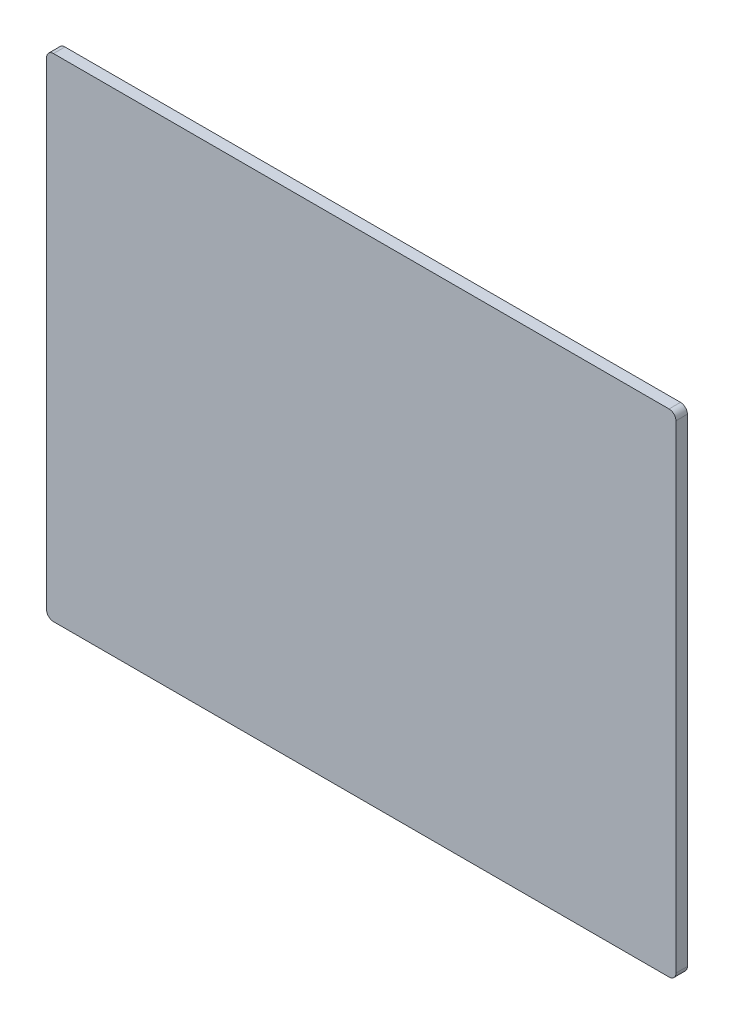
ISO-10303-21;
HEADER;
FILE_DESCRIPTION(('STEP AP214'),'2;1');
FILE_NAME('part.step','',(''),(''),'','','');
FILE_SCHEMA(('AUTOMOTIVE_DESIGN { 1 0 10303 214 1 1 1 1 }'));
ENDSEC;
DATA;
#1=APPLICATION_CONTEXT('core data for automotive mechanical design processes');
#2=APPLICATION_PROTOCOL_DEFINITION('international standard','automotive_design',2000,#1);
#3=PRODUCT_CONTEXT('',#1,'mechanical');
#4=PRODUCT('Part','Part','',(#3));
#5=PRODUCT_RELATED_PRODUCT_CATEGORY('part','',(#4));
#6=PRODUCT_DEFINITION_FORMATION('','',#4);
#7=PRODUCT_DEFINITION_CONTEXT('part definition',#1,'design');
#8=PRODUCT_DEFINITION('design','',#6,#7);
#9=PRODUCT_DEFINITION_SHAPE('','',#8);
#10=(LENGTH_UNIT() NAMED_UNIT(*) SI_UNIT(.MILLI.,.METRE.));
#11=(NAMED_UNIT(*) PLANE_ANGLE_UNIT() SI_UNIT($,.RADIAN.));
#12=(NAMED_UNIT(*) SI_UNIT($,.STERADIAN.) SOLID_ANGLE_UNIT());
#13=UNCERTAINTY_MEASURE_WITH_UNIT(LENGTH_MEASURE(1.E-05),#10,'distance_accuracy_value','');
#14=(GEOMETRIC_REPRESENTATION_CONTEXT(3) GLOBAL_UNCERTAINTY_ASSIGNED_CONTEXT((#13)) GLOBAL_UNIT_ASSIGNED_CONTEXT((#10,
#11,#12)) REPRESENTATION_CONTEXT('',''));
#15=CARTESIAN_POINT('',(0.,0.,0.));
#16=DIRECTION('',(0.,0.,1.));
#17=DIRECTION('',(1.,0.,0.));
#18=AXIS2_PLACEMENT_3D('',#15,#16,#17);
#19=CARTESIAN_POINT('',(3.,212.,0.));
#20=DIRECTION('',(0.,0.,-1.));
#21=DIRECTION('',(-1.,0.,0.));
#22=AXIS2_PLACEMENT_3D('',#19,#20,#21);
#23=CYLINDRICAL_SURFACE('',#22,3.);
#24=DIRECTION('',(0.,0.,1.));
#25=VECTOR('',#24,1.);
#26=CARTESIAN_POINT('',(3.00000000000002,215.,0.));
#27=LINE('',#26,#25);
#28=CARTESIAN_POINT('',(3.,215.,-5.));
#29=VERTEX_POINT('',#28);
#30=CARTESIAN_POINT('',(3.00000000000002,215.,0.));
#31=VERTEX_POINT('',#30);
#32=EDGE_CURVE('E11',#29,#31,#27,.T.);
#33=ORIENTED_EDGE('',*,*,#32,.F.);
#34=CARTESIAN_POINT('',(3.,212.,-5.));
#35=DIRECTION('',(0.,0.,1.));
#36=DIRECTION('',(1.,0.,0.));
#37=AXIS2_PLACEMENT_3D('',#34,#35,#36);
#38=CIRCLE('',#37,3.);
#39=CARTESIAN_POINT('',(0.,212.,-5.));
#40=VERTEX_POINT('',#39);
#41=EDGE_CURVE('E107',#29,#40,#38,.T.);
#42=ORIENTED_EDGE('',*,*,#41,.T.);
#43=DIRECTION('',(0.,0.,1.));
#44=VECTOR('',#43,1.);
#45=CARTESIAN_POINT('',(0.,212.,0.));
#46=LINE('',#45,#44);
#47=CARTESIAN_POINT('',(0.,212.,0.));
#48=VERTEX_POINT('',#47);
#49=EDGE_CURVE('E50',#40,#48,#46,.T.);
#50=ORIENTED_EDGE('',*,*,#49,.T.);
#51=CARTESIAN_POINT('',(3.,212.,0.));
#52=DIRECTION('',(0.,0.,1.));
#53=DIRECTION('',(-1.,0.,0.));
#54=AXIS2_PLACEMENT_3D('',#51,#52,#53);
#55=CIRCLE('',#54,3.);
#56=EDGE_CURVE('E156',#31,#48,#55,.T.);
#57=ORIENTED_EDGE('',*,*,#56,.F.);
#58=EDGE_LOOP('',(#33,#42,#50,#57));
#59=FACE_BOUND('',#58,.T.);
#60=ADVANCED_FACE('F40',(#59),#23,.T.);
#61=CARTESIAN_POINT('',(0.,3.00000000000002,0.));
#62=DIRECTION('',(1.,0.,0.));
#63=DIRECTION('',(0.,-1.,0.));
#64=AXIS2_PLACEMENT_3D('',#61,#62,#63);
#65=PLANE('',#64);
#66=ORIENTED_EDGE('',*,*,#49,.F.);
#67=DIRECTION('',(0.,1.,0.));
#68=VECTOR('',#67,1.);
#69=CARTESIAN_POINT('',(0.,212.,-5.));
#70=LINE('',#69,#68);
#71=CARTESIAN_POINT('',(0.,3.00000000000003,-5.));
#72=VERTEX_POINT('',#71);
#73=EDGE_CURVE('E134',#40,#72,#70,.F.);
#74=ORIENTED_EDGE('',*,*,#73,.T.);
#75=DIRECTION('',(0.,0.,1.));
#76=VECTOR('',#75,1.);
#77=CARTESIAN_POINT('',(0.,3.00000000000002,0.));
#78=LINE('',#77,#76);
#79=CARTESIAN_POINT('',(0.,3.00000000000002,0.));
#80=VERTEX_POINT('',#79);
#81=EDGE_CURVE('E149',#72,#80,#78,.T.);
#82=ORIENTED_EDGE('',*,*,#81,.T.);
#83=DIRECTION('',(0.,-1.,0.));
#84=VECTOR('',#83,1.);
#85=CARTESIAN_POINT('',(0.,3.00000000000002,0.));
#86=LINE('',#85,#84);
#87=EDGE_CURVE('E165',#48,#80,#86,.T.);
#88=ORIENTED_EDGE('',*,*,#87,.F.);
#89=EDGE_LOOP('',(#66,#74,#82,#88));
#90=FACE_BOUND('',#89,.T.);
#91=ADVANCED_FACE('F169',(#90),#65,.F.);
#92=CARTESIAN_POINT('',(3.,3.,0.));
#93=DIRECTION('',(0.,0.,-1.));
#94=DIRECTION('',(-1.,0.,0.));
#95=AXIS2_PLACEMENT_3D('',#92,#93,#94);
#96=CYLINDRICAL_SURFACE('',#95,3.);
#97=ORIENTED_EDGE('',*,*,#81,.F.);
#98=CARTESIAN_POINT('',(3.,3.,-5.));
#99=DIRECTION('',(0.,0.,1.));
#100=DIRECTION('',(1.,0.,0.));
#101=AXIS2_PLACEMENT_3D('',#98,#99,#100);
#102=CIRCLE('',#101,3.);
#103=CARTESIAN_POINT('',(3.,0.,-5.));
#104=VERTEX_POINT('',#103);
#105=EDGE_CURVE('E130',#72,#104,#102,.T.);
#106=ORIENTED_EDGE('',*,*,#105,.T.);
#107=DIRECTION('',(0.,0.,1.));
#108=VECTOR('',#107,1.);
#109=CARTESIAN_POINT('',(3.00000000000002,0.,0.));
#110=LINE('',#109,#108);
#111=CARTESIAN_POINT('',(3.00000000000002,0.,0.));
#112=VERTEX_POINT('',#111);
#113=EDGE_CURVE('E146',#104,#112,#110,.T.);
#114=ORIENTED_EDGE('',*,*,#113,.T.);
#115=CARTESIAN_POINT('',(3.,3.,0.));
#116=DIRECTION('',(0.,0.,1.));
#117=DIRECTION('',(-1.,0.,0.));
#118=AXIS2_PLACEMENT_3D('',#115,#116,#117);
#119=CIRCLE('',#118,3.);
#120=EDGE_CURVE('E171',#80,#112,#119,.T.);
#121=ORIENTED_EDGE('',*,*,#120,.F.);
#122=EDGE_LOOP('',(#97,#106,#114,#121));
#123=FACE_BOUND('',#122,.T.);
#124=ADVANCED_FACE('F203',(#123),#96,.T.);
#125=CARTESIAN_POINT('',(3.00000000000002,0.,0.));
#126=DIRECTION('',(0.,1.,0.));
#127=DIRECTION('',(1.,0.,0.));
#128=AXIS2_PLACEMENT_3D('',#125,#126,#127);
#129=PLANE('',#128);
#130=ORIENTED_EDGE('',*,*,#113,.F.);
#131=DIRECTION('',(-1.,0.,0.));
#132=VECTOR('',#131,1.);
#133=CARTESIAN_POINT('',(272.,0.,-5.));
#134=LINE('',#133,#132);
#135=CARTESIAN_POINT('',(272.,0.,-5.));
#136=VERTEX_POINT('',#135);
#137=EDGE_CURVE('E126',#104,#136,#134,.F.);
#138=ORIENTED_EDGE('',*,*,#137,.T.);
#139=DIRECTION('',(0.,0.,1.));
#140=VECTOR('',#139,1.);
#141=CARTESIAN_POINT('',(272.,0.,0.));
#142=LINE('',#141,#140);
#143=CARTESIAN_POINT('',(272.,0.,0.));
#144=VERTEX_POINT('',#143);
#145=EDGE_CURVE('E143',#136,#144,#142,.T.);
#146=ORIENTED_EDGE('',*,*,#145,.T.);
#147=DIRECTION('',(1.,0.,0.));
#148=VECTOR('',#147,1.);
#149=CARTESIAN_POINT('',(3.00000000000002,0.,0.));
#150=LINE('',#149,#148);
#151=EDGE_CURVE('E176',#112,#144,#150,.T.);
#152=ORIENTED_EDGE('',*,*,#151,.F.);
#153=EDGE_LOOP('',(#130,#138,#146,#152));
#154=FACE_BOUND('',#153,.T.);
#155=ADVANCED_FACE('F199',(#154),#129,.F.);
#156=CARTESIAN_POINT('',(272.,3.,0.));
#157=DIRECTION('',(0.,0.,-1.));
#158=DIRECTION('',(-1.,0.,0.));
#159=AXIS2_PLACEMENT_3D('',#156,#157,#158);
#160=CYLINDRICAL_SURFACE('',#159,3.);
#161=ORIENTED_EDGE('',*,*,#145,.F.);
#162=CARTESIAN_POINT('',(272.,3.,-5.));
#163=DIRECTION('',(0.,0.,1.));
#164=DIRECTION('',(1.,0.,0.));
#165=AXIS2_PLACEMENT_3D('',#162,#163,#164);
#166=CIRCLE('',#165,3.);
#167=CARTESIAN_POINT('',(275.,3.,-5.));
#168=VERTEX_POINT('',#167);
#169=EDGE_CURVE('E122',#136,#168,#166,.T.);
#170=ORIENTED_EDGE('',*,*,#169,.T.);
#171=DIRECTION('',(0.,0.,1.));
#172=VECTOR('',#171,1.);
#173=CARTESIAN_POINT('',(275.,3.,0.));
#174=LINE('',#173,#172);
#175=CARTESIAN_POINT('',(275.,3.,0.));
#176=VERTEX_POINT('',#175);
#177=EDGE_CURVE('E141',#168,#176,#174,.T.);
#178=ORIENTED_EDGE('',*,*,#177,.T.);
#179=CARTESIAN_POINT('',(272.,3.,0.));
#180=DIRECTION('',(0.,0.,1.));
#181=DIRECTION('',(1.,0.,0.));
#182=AXIS2_PLACEMENT_3D('',#179,#180,#181);
#183=CIRCLE('',#182,3.);
#184=EDGE_CURVE('E182',#144,#176,#183,.T.);
#185=ORIENTED_EDGE('',*,*,#184,.F.);
#186=EDGE_LOOP('',(#161,#170,#178,#185));
#187=FACE_BOUND('',#186,.T.);
#188=ADVANCED_FACE('F195',(#187),#160,.T.);
#189=CARTESIAN_POINT('',(275.,3.00000000000002,0.));
#190=DIRECTION('',(-1.,0.,0.));
#191=DIRECTION('',(0.,1.,0.));
#192=AXIS2_PLACEMENT_3D('',#189,#190,#191);
#193=PLANE('',#192);
#194=ORIENTED_EDGE('',*,*,#177,.F.);
#195=DIRECTION('',(0.,1.,0.));
#196=VECTOR('',#195,1.);
#197=CARTESIAN_POINT('',(275.,212.,-5.));
#198=LINE('',#197,#196);
#199=CARTESIAN_POINT('',(275.,212.,-5.));
#200=VERTEX_POINT('',#199);
#201=EDGE_CURVE('E118',#168,#200,#198,.T.);
#202=ORIENTED_EDGE('',*,*,#201,.T.);
#203=DIRECTION('',(0.,0.,1.));
#204=VECTOR('',#203,1.);
#205=CARTESIAN_POINT('',(275.,212.,0.));
#206=LINE('',#205,#204);
#207=CARTESIAN_POINT('',(275.,212.,0.));
#208=VERTEX_POINT('',#207);
#209=EDGE_CURVE('E58',#200,#208,#206,.T.);
#210=ORIENTED_EDGE('',*,*,#209,.T.);
#211=DIRECTION('',(0.,1.,0.));
#212=VECTOR('',#211,1.);
#213=CARTESIAN_POINT('',(275.,3.00000000000002,0.));
#214=LINE('',#213,#212);
#215=EDGE_CURVE('E100',#176,#208,#214,.T.);
#216=ORIENTED_EDGE('',*,*,#215,.F.);
#217=EDGE_LOOP('',(#194,#202,#210,#216));
#218=FACE_BOUND('',#217,.T.);
#219=ADVANCED_FACE('F192',(#218),#193,.F.);
#220=CARTESIAN_POINT('',(272.,212.,0.));
#221=DIRECTION('',(0.,0.,-1.));
#222=DIRECTION('',(-1.,0.,0.));
#223=AXIS2_PLACEMENT_3D('',#220,#221,#222);
#224=CYLINDRICAL_SURFACE('',#223,3.);
#225=ORIENTED_EDGE('',*,*,#209,.F.);
#226=CARTESIAN_POINT('',(272.,212.,-5.));
#227=DIRECTION('',(0.,0.,1.));
#228=DIRECTION('',(1.,0.,0.));
#229=AXIS2_PLACEMENT_3D('',#226,#227,#228);
#230=CIRCLE('',#229,3.);
#231=CARTESIAN_POINT('',(272.,215.,-5.));
#232=VERTEX_POINT('',#231);
#233=EDGE_CURVE('E105',#200,#232,#230,.T.);
#234=ORIENTED_EDGE('',*,*,#233,.T.);
#235=DIRECTION('',(0.,0.,1.));
#236=VECTOR('',#235,1.);
#237=CARTESIAN_POINT('',(272.,215.,0.));
#238=LINE('',#237,#236);
#239=CARTESIAN_POINT('',(272.,215.,0.));
#240=VERTEX_POINT('',#239);
#241=EDGE_CURVE('E44',#232,#240,#238,.T.);
#242=ORIENTED_EDGE('',*,*,#241,.T.);
#243=CARTESIAN_POINT('',(272.,212.,0.));
#244=DIRECTION('',(0.,0.,1.));
#245=DIRECTION('',(-1.,0.,0.));
#246=AXIS2_PLACEMENT_3D('',#243,#244,#245);
#247=CIRCLE('',#246,3.);
#248=EDGE_CURVE('E121',#208,#240,#247,.T.);
#249=ORIENTED_EDGE('',*,*,#248,.F.);
#250=EDGE_LOOP('',(#225,#234,#242,#249));
#251=FACE_BOUND('',#250,.T.);
#252=ADVANCED_FACE('F110',(#251),#224,.T.);
#253=CARTESIAN_POINT('',(3.00000000000002,215.,0.));
#254=DIRECTION('',(0.,-1.,0.));
#255=DIRECTION('',(-1.,0.,0.));
#256=AXIS2_PLACEMENT_3D('',#253,#254,#255);
#257=PLANE('',#256);
#258=DIRECTION('',(-1.,0.,0.));
#259=VECTOR('',#258,1.);
#260=CARTESIAN_POINT('',(272.,215.,-5.));
#261=LINE('',#260,#259);
#262=EDGE_CURVE('E94',#232,#29,#261,.T.);
#263=ORIENTED_EDGE('',*,*,#262,.T.);
#264=ORIENTED_EDGE('',*,*,#32,.T.);
#265=DIRECTION('',(-1.,0.,0.));
#266=VECTOR('',#265,1.);
#267=CARTESIAN_POINT('',(3.00000000000002,215.,0.));
#268=LINE('',#267,#266);
#269=EDGE_CURVE('E96',#240,#31,#268,.T.);
#270=ORIENTED_EDGE('',*,*,#269,.F.);
#271=ORIENTED_EDGE('',*,*,#241,.F.);
#272=EDGE_LOOP('',(#263,#264,#270,#271));
#273=FACE_BOUND('',#272,.T.);
#274=ADVANCED_FACE('F42',(#273),#257,.F.);
#275=CARTESIAN_POINT('',(272.,212.,0.));
#276=DIRECTION('',(0.,0.,-1.));
#277=DIRECTION('',(-1.,0.,0.));
#278=AXIS2_PLACEMENT_3D('',#275,#276,#277);
#279=PLANE('',#278);
#280=ORIENTED_EDGE('',*,*,#248,.T.);
#281=ORIENTED_EDGE('',*,*,#269,.T.);
#282=ORIENTED_EDGE('',*,*,#56,.T.);
#283=ORIENTED_EDGE('',*,*,#87,.T.);
#284=ORIENTED_EDGE('',*,*,#120,.T.);
#285=ORIENTED_EDGE('',*,*,#151,.T.);
#286=ORIENTED_EDGE('',*,*,#184,.T.);
#287=ORIENTED_EDGE('',*,*,#215,.T.);
#288=EDGE_LOOP('',(#280,#281,#282,#283,#284,#285,#286,#287));
#289=FACE_BOUND('',#288,.T.);
#290=ADVANCED_FACE('F163',(#289),#279,.F.);
#291=CARTESIAN_POINT('',(272.,212.,-5.));
#292=DIRECTION('',(0.,0.,-1.));
#293=DIRECTION('',(-1.,0.,0.));
#294=AXIS2_PLACEMENT_3D('',#291,#292,#293);
#295=PLANE('',#294);
#296=ORIENTED_EDGE('',*,*,#233,.F.);
#297=ORIENTED_EDGE('',*,*,#201,.F.);
#298=ORIENTED_EDGE('',*,*,#169,.F.);
#299=ORIENTED_EDGE('',*,*,#137,.F.);
#300=ORIENTED_EDGE('',*,*,#105,.F.);
#301=ORIENTED_EDGE('',*,*,#73,.F.);
#302=ORIENTED_EDGE('',*,*,#41,.F.);
#303=ORIENTED_EDGE('',*,*,#262,.F.);
#304=EDGE_LOOP('',(#296,#297,#298,#299,#300,#301,#302,#303));
#305=FACE_BOUND('',#304,.T.);
#306=ADVANCED_FACE('F103',(#305),#295,.T.);
#307=CLOSED_SHELL('',(#60,#91,#124,#155,#188,#219,#252,#274,#290,#306));
#308=MANIFOLD_SOLID_BREP('B2',#307);
#309=ADVANCED_BREP_SHAPE_REPRESENTATION('',(#18,#308),#14);
#310=SHAPE_DEFINITION_REPRESENTATION(#9,#309);
ENDSEC;
END-ISO-10303-21;
